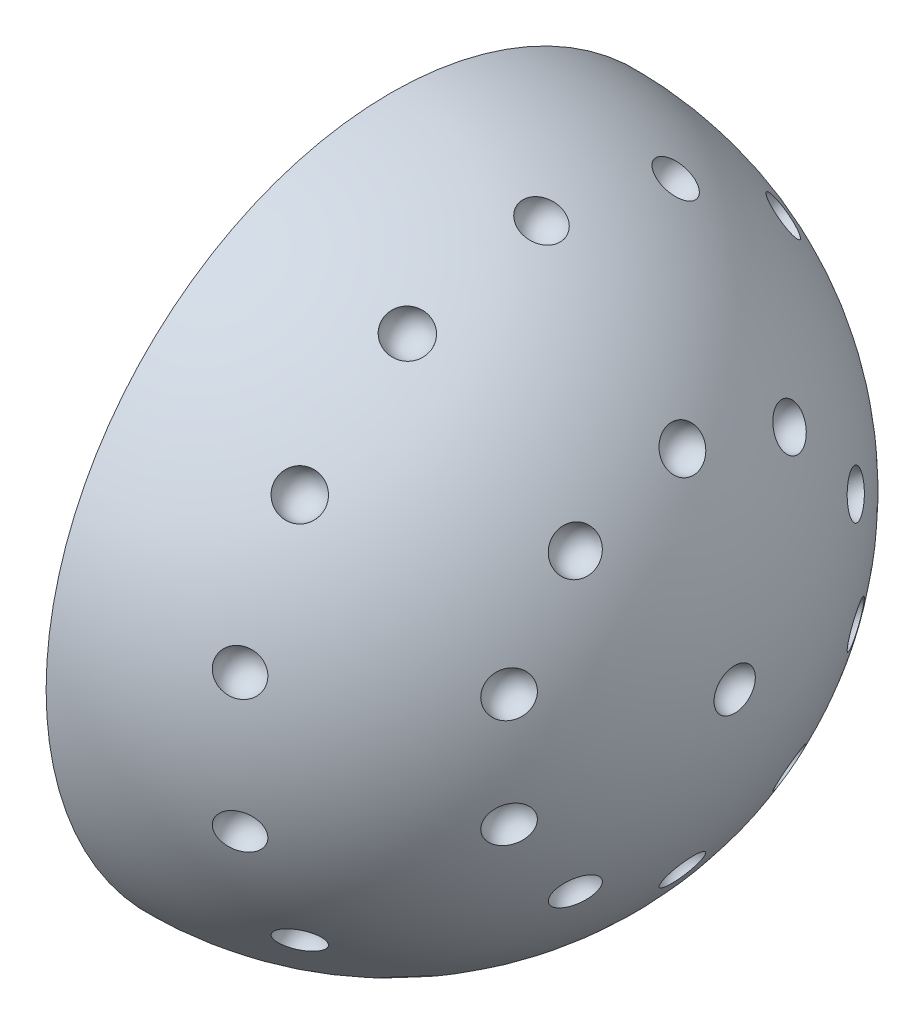
ISO-10303-21;
HEADER;
FILE_DESCRIPTION(('STEP AP214'),'2;1');
FILE_NAME('part.step','',(''),(''),'','','');
FILE_SCHEMA(('AUTOMOTIVE_DESIGN { 1 0 10303 214 1 1 1 1 }'));
ENDSEC;
DATA;
#1=APPLICATION_CONTEXT('core data for automotive mechanical design processes');
#2=APPLICATION_PROTOCOL_DEFINITION('international standard','automotive_design',2000,#1);
#3=PRODUCT_CONTEXT('',#1,'mechanical');
#4=PRODUCT('Part','Part','',(#3));
#5=PRODUCT_RELATED_PRODUCT_CATEGORY('part','',(#4));
#6=PRODUCT_DEFINITION_FORMATION('','',#4);
#7=PRODUCT_DEFINITION_CONTEXT('part definition',#1,'design');
#8=PRODUCT_DEFINITION('design','',#6,#7);
#9=PRODUCT_DEFINITION_SHAPE('','',#8);
#10=(LENGTH_UNIT() NAMED_UNIT(*) SI_UNIT(.MILLI.,.METRE.));
#11=(NAMED_UNIT(*) PLANE_ANGLE_UNIT() SI_UNIT($,.RADIAN.));
#12=(NAMED_UNIT(*) SI_UNIT($,.STERADIAN.) SOLID_ANGLE_UNIT());
#13=UNCERTAINTY_MEASURE_WITH_UNIT(LENGTH_MEASURE(1.E-05),#10,'distance_accuracy_value','');
#14=(GEOMETRIC_REPRESENTATION_CONTEXT(3) GLOBAL_UNCERTAINTY_ASSIGNED_CONTEXT((#13)) GLOBAL_UNIT_ASSIGNED_CONTEXT((#10,
#11,#12)) REPRESENTATION_CONTEXT('',''));
#15=CARTESIAN_POINT('',(0.,0.,0.));
#16=DIRECTION('',(0.,0.,1.));
#17=DIRECTION('',(1.,0.,0.));
#18=AXIS2_PLACEMENT_3D('',#15,#16,#17);
#19=CARTESIAN_POINT('',(43.8437023139506,80.9907145114152,39.0030724677829));
#20=DIRECTION('',(0.438371146789075,0.809785454371601,0.389972121504872));
#21=DIRECTION('',(0.898794046299168,-0.394958755843641,-0.190202112290091));
#22=AXIS2_PLACEMENT_3D('',#19,#20,#21);
#23=SPHERICAL_SURFACE('',#22,6.);
#24=CARTESIAN_POINT('',(43.7582202233519,80.8328068706339,38.9270281558668));
#25=DIRECTION('',(0.438371146789075,0.809785454371601,0.389972121504872));
#26=DIRECTION('',(-0.898794046299168,0.394958755843641,0.190202112290091));
#27=AXIS2_PLACEMENT_3D('',#24,#25,#26);
#28=CIRCLE('',#27,5.99683043380393);
#29=CARTESIAN_POINT('',(38.3683047327833,83.2013075577744,40.0676379714218));
#30=VERTEX_POINT('',#29);
#31=EDGE_CURVE('E10',#30,#30,#28,.T.);
#32=ORIENTED_EDGE('',*,*,#31,.T.);
#33=EDGE_LOOP('',(#32));
#34=FACE_BOUND('',#33,.T.);
#35=ADVANCED_FACE('F41',(#34),#23,.F.);
#36=CARTESIAN_POINT('',(43.8437023139506,56.047313444563,70.2811080920299));
#37=DIRECTION('',(0.438371146789075,0.560388921838886,0.702705481651511));
#38=DIRECTION('',(0.898794046299168,-0.273319939452111,-0.34273236356531));
#39=AXIS2_PLACEMENT_3D('',#36,#37,#38);
#40=SPHERICAL_SURFACE('',#39,6.);
#41=CARTESIAN_POINT('',(43.7582202233519,55.9380379666079,70.144080976795));
#42=DIRECTION('',(0.438371146789075,0.560388921838886,0.702705481651511));
#43=DIRECTION('',(-0.898794046299168,0.273319939452111,0.34273236356531));
#44=AXIS2_PLACEMENT_3D('',#41,#42,#43);
#45=CIRCLE('',#44,5.99683043380393);
#46=CARTESIAN_POINT('',(38.3683047327833,57.5770912976798,72.199388845273));
#47=VERTEX_POINT('',#46);
#48=EDGE_CURVE('E48',#47,#47,#45,.T.);
#49=ORIENTED_EDGE('',*,*,#48,.T.);
#50=EDGE_LOOP('',(#49));
#51=FACE_BOUND('',#50,.T.);
#52=ADVANCED_FACE('F178',(#51),#40,.F.);
#53=CARTESIAN_POINT('',(43.8437023139506,20.0030545748246,87.6391083174246));
#54=DIRECTION('',(0.438371146789075,0.200000490616875,0.876259403039899));
#55=DIRECTION('',(0.898794046299168,-0.0975467570030101,-0.427380266899824));
#56=AXIS2_PLACEMENT_3D('',#53,#54,#55);
#57=SPHERICAL_SURFACE('',#56,6.);
#58=CARTESIAN_POINT('',(43.7582202233519,19.9640546082805,87.4682382995704));
#59=DIRECTION('',(0.438371146789075,0.200000490616875,0.876259403039899));
#60=DIRECTION('',(-0.898794046299168,0.0975467570030101,0.427380266899824));
#61=AXIS2_PLACEMENT_3D('',#58,#59,#60);
#62=CIRCLE('',#61,5.99683043380393);
#63=CARTESIAN_POINT('',(38.3683047327833,20.549025969395,90.0311652909225));
#64=VERTEX_POINT('',#63);
#65=EDGE_CURVE('E53',#64,#64,#62,.T.);
#66=ORIENTED_EDGE('',*,*,#65,.T.);
#67=EDGE_LOOP('',(#66));
#68=FACE_BOUND('',#67,.T.);
#69=ADVANCED_FACE('F182',(#68),#57,.F.);
#70=CARTESIAN_POINT('',(43.8437023139506,-20.0030545748229,87.639108317425));
#71=DIRECTION('',(0.438371146789075,-0.200000490616857,0.876259403039903));
#72=DIRECTION('',(0.898794046299168,0.0975467570030015,-0.427380266899826));
#73=AXIS2_PLACEMENT_3D('',#70,#71,#72);
#74=SPHERICAL_SURFACE('',#73,6.);
#75=CARTESIAN_POINT('',(43.7582202233519,-19.9640546082787,87.4682382995708));
#76=DIRECTION('',(0.438371146789075,-0.200000490616857,0.876259403039903));
#77=DIRECTION('',(-0.898794046299168,-0.0975467570030015,0.427380266899826));
#78=AXIS2_PLACEMENT_3D('',#75,#76,#77);
#79=CIRCLE('',#78,5.99683043380393);
#80=CARTESIAN_POINT('',(38.3683047327833,-20.5490259693932,90.0311652909229));
#81=VERTEX_POINT('',#80);
#82=EDGE_CURVE('E58',#81,#81,#79,.T.);
#83=ORIENTED_EDGE('',*,*,#82,.T.);
#84=EDGE_LOOP('',(#83));
#85=FACE_BOUND('',#84,.T.);
#86=ADVANCED_FACE('F186',(#85),#74,.F.);
#87=CARTESIAN_POINT('',(43.8437023139506,-56.0473134445616,70.2811080920311));
#88=DIRECTION('',(0.438371146789075,-0.560388921838872,0.702705481651523));
#89=DIRECTION('',(0.898794046299168,0.273319939452103,-0.342732363565315));
#90=AXIS2_PLACEMENT_3D('',#87,#88,#89);
#91=SPHERICAL_SURFACE('',#90,6.);
#92=CARTESIAN_POINT('',(43.7582202233519,-55.9380379666064,70.1440809767962));
#93=DIRECTION('',(0.438371146789075,-0.560388921838872,0.702705481651522));
#94=DIRECTION('',(-0.898794046299168,-0.273319939452103,0.342732363565315));
#95=AXIS2_PLACEMENT_3D('',#92,#93,#94);
#96=CIRCLE('',#95,5.99683043380393);
#97=CARTESIAN_POINT('',(38.3683047327833,-57.5770912976782,72.1993888452742));
#98=VERTEX_POINT('',#97);
#99=EDGE_CURVE('E64',#98,#98,#96,.T.);
#100=ORIENTED_EDGE('',*,*,#99,.T.);
#101=EDGE_LOOP('',(#100));
#102=FACE_BOUND('',#101,.T.);
#103=ADVANCED_FACE('F192',(#102),#91,.F.);
#104=CARTESIAN_POINT('',(43.8437023139506,-80.9907145114144,39.0030724677846));
#105=DIRECTION('',(0.438371146789075,-0.809785454371593,0.389972121504889));
#106=DIRECTION('',(0.898794046299168,0.394958755843637,-0.190202112290099));
#107=AXIS2_PLACEMENT_3D('',#104,#105,#106);
#108=SPHERICAL_SURFACE('',#107,6.);
#109=CARTESIAN_POINT('',(43.7582202233519,-80.8328068706331,38.9270281558685));
#110=DIRECTION('',(0.438371146789075,-0.809785454371593,0.389972121504889));
#111=DIRECTION('',(-0.898794046299168,-0.394958755843637,0.190202112290099));
#112=AXIS2_PLACEMENT_3D('',#109,#110,#111);
#113=CIRCLE('',#112,5.99683043380393);
#114=CARTESIAN_POINT('',(38.3683047327833,-83.2013075577735,40.0676379714235));
#115=VERTEX_POINT('',#114);
#116=EDGE_CURVE('E68',#115,#115,#113,.T.);
#117=ORIENTED_EDGE('',*,*,#116,.T.);
#118=EDGE_LOOP('',(#117));
#119=FACE_BOUND('',#118,.T.);
#120=ADVANCED_FACE('F196',(#119),#108,.F.);
#121=CARTESIAN_POINT('',(43.8437023139506,-89.8929112833525,0.));
#122=DIRECTION('',(0.438371146789075,-0.898794046299168,0.));
#123=DIRECTION('',(0.898794046299168,0.438371146789075,0.));
#124=AXIS2_PLACEMENT_3D('',#121,#122,#123);
#125=SPHERICAL_SURFACE('',#124,6.);
#126=CARTESIAN_POINT('',(43.7582202233519,-89.7176470246118,0.));
#127=DIRECTION('',(0.438371146789075,-0.898794046299168,0.));
#128=DIRECTION('',(-0.898794046299168,-0.438371146789075,0.));
#129=AXIS2_PLACEMENT_3D('',#126,#127,#128);
#130=CIRCLE('',#129,5.99683043380393);
#131=CARTESIAN_POINT('',(38.3683047327833,-92.3464844589781,0.));
#132=VERTEX_POINT('',#131);
#133=EDGE_CURVE('E72',#132,#132,#130,.T.);
#134=ORIENTED_EDGE('',*,*,#133,.T.);
#135=EDGE_LOOP('',(#134));
#136=FACE_BOUND('',#135,.T.);
#137=ADVANCED_FACE('F200',(#136),#125,.F.);
#138=CARTESIAN_POINT('',(43.8437023139506,-80.990714511415,-39.0030724677834));
#139=DIRECTION('',(0.438371146789075,-0.809785454371599,-0.389972121504878));
#140=DIRECTION('',(0.898794046299168,0.39495875584364,0.190202112290094));
#141=AXIS2_PLACEMENT_3D('',#138,#139,#140);
#142=SPHERICAL_SURFACE('',#141,6.);
#143=CARTESIAN_POINT('',(43.7582202233519,-80.8328068706336,-38.9270281558674));
#144=DIRECTION('',(0.438371146789075,-0.809785454371598,-0.389972121504878));
#145=DIRECTION('',(-0.898794046299168,-0.39495875584364,-0.190202112290094));
#146=AXIS2_PLACEMENT_3D('',#143,#144,#145);
#147=CIRCLE('',#146,5.99683043380393);
#148=CARTESIAN_POINT('',(38.3683047327833,-83.2013075577741,-40.0676379714224));
#149=VERTEX_POINT('',#148);
#150=EDGE_CURVE('E76',#149,#149,#147,.T.);
#151=ORIENTED_EDGE('',*,*,#150,.T.);
#152=EDGE_LOOP('',(#151));
#153=FACE_BOUND('',#152,.T.);
#154=ADVANCED_FACE('F204',(#153),#142,.F.);
#155=CARTESIAN_POINT('',(43.8437023139506,-56.0473134445625,-70.2811080920303));
#156=DIRECTION('',(0.438371146789075,-0.560388921838881,-0.702705481651515));
#157=DIRECTION('',(0.898794046299168,0.273319939452108,0.342732363565312));
#158=AXIS2_PLACEMENT_3D('',#155,#156,#157);
#159=SPHERICAL_SURFACE('',#158,6.);
#160=CARTESIAN_POINT('',(43.7582202233519,-55.9380379666074,-70.1440809767954));
#161=DIRECTION('',(0.438371146789075,-0.560388921838881,-0.702705481651515));
#162=DIRECTION('',(-0.898794046299168,-0.273319939452108,-0.342732363565312));
#163=AXIS2_PLACEMENT_3D('',#160,#161,#162);
#164=CIRCLE('',#163,5.99683043380393);
#165=CARTESIAN_POINT('',(38.3683047327833,-57.5770912976792,-72.1993888452734));
#166=VERTEX_POINT('',#165);
#167=EDGE_CURVE('E80',#166,#166,#164,.T.);
#168=ORIENTED_EDGE('',*,*,#167,.T.);
#169=EDGE_LOOP('',(#168));
#170=FACE_BOUND('',#169,.T.);
#171=ADVANCED_FACE('F208',(#170),#159,.F.);
#172=CARTESIAN_POINT('',(43.8437023139506,-20.0030545748241,-87.6391083174247));
#173=DIRECTION('',(0.438371146789075,-0.200000490616869,-0.876259403039901));
#174=DIRECTION('',(0.898794046299168,0.0975467570030073,0.427380266899825));
#175=AXIS2_PLACEMENT_3D('',#172,#173,#174);
#176=SPHERICAL_SURFACE('',#175,6.);
#177=CARTESIAN_POINT('',(43.7582202233519,-19.9640546082799,-87.4682382995705));
#178=DIRECTION('',(0.438371146789075,-0.200000490616869,-0.8762594030399));
#179=DIRECTION('',(-0.898794046299168,-0.0975467570030073,-0.427380266899825));
#180=AXIS2_PLACEMENT_3D('',#177,#178,#179);
#181=CIRCLE('',#180,5.99683043380393);
#182=CARTESIAN_POINT('',(38.3683047327833,-20.5490259693944,-90.0311652909227));
#183=VERTEX_POINT('',#182);
#184=EDGE_CURVE('E84',#183,#183,#181,.T.);
#185=ORIENTED_EDGE('',*,*,#184,.T.);
#186=EDGE_LOOP('',(#185));
#187=FACE_BOUND('',#186,.T.);
#188=ADVANCED_FACE('F212',(#187),#176,.F.);
#189=CARTESIAN_POINT('',(43.8437023139506,20.0030545748234,-87.6391083174248));
#190=DIRECTION('',(0.438371146789075,0.200000490616863,-0.876259403039902));
#191=DIRECTION('',(0.898794046299168,-0.0975467570030043,0.427380266899825));
#192=AXIS2_PLACEMENT_3D('',#189,#190,#191);
#193=SPHERICAL_SURFACE('',#192,6.);
#194=CARTESIAN_POINT('',(43.7582202233519,19.9640546082793,-87.4682382995707));
#195=DIRECTION('',(0.438371146789075,0.200000490616863,-0.876259403039902));
#196=DIRECTION('',(-0.898794046299168,0.0975467570030043,-0.427380266899825));
#197=AXIS2_PLACEMENT_3D('',#194,#195,#196);
#198=CIRCLE('',#197,5.99683043380393);
#199=CARTESIAN_POINT('',(38.3683047327833,20.5490259693938,-90.0311652909228));
#200=VERTEX_POINT('',#199);
#201=EDGE_CURVE('E88',#200,#200,#198,.T.);
#202=ORIENTED_EDGE('',*,*,#201,.T.);
#203=EDGE_LOOP('',(#202));
#204=FACE_BOUND('',#203,.T.);
#205=ADVANCED_FACE('F216',(#204),#193,.F.);
#206=CARTESIAN_POINT('',(43.8437023139506,56.0473134445621,-70.2811080920307));
#207=DIRECTION('',(0.438371146789075,0.560388921838876,-0.702705481651519));
#208=DIRECTION('',(0.898794046299168,-0.273319939452106,0.342732363565314));
#209=AXIS2_PLACEMENT_3D('',#206,#207,#208);
#210=SPHERICAL_SURFACE('',#209,6.);
#211=CARTESIAN_POINT('',(43.7582202233519,55.9380379666069,-70.1440809767958));
#212=DIRECTION('',(0.438371146789075,0.560388921838876,-0.702705481651519));
#213=DIRECTION('',(-0.898794046299168,0.273319939452106,-0.342732363565314));
#214=AXIS2_PLACEMENT_3D('',#211,#212,#213);
#215=CIRCLE('',#214,5.99683043380393);
#216=CARTESIAN_POINT('',(38.3683047327833,57.5770912976787,-72.1993888452738));
#217=VERTEX_POINT('',#216);
#218=EDGE_CURVE('E92',#217,#217,#215,.T.);
#219=ORIENTED_EDGE('',*,*,#218,.T.);
#220=EDGE_LOOP('',(#219));
#221=FACE_BOUND('',#220,.T.);
#222=ADVANCED_FACE('F220',(#221),#210,.F.);
#223=CARTESIAN_POINT('',(43.8437023139506,80.9907145114147,-39.003072467784));
#224=DIRECTION('',(0.438371146789075,0.809785454371596,-0.389972121504884));
#225=DIRECTION('',(0.898794046299168,-0.394958755843638,0.190202112290096));
#226=AXIS2_PLACEMENT_3D('',#223,#224,#225);
#227=SPHERICAL_SURFACE('',#226,6.);
#228=CARTESIAN_POINT('',(43.7582202233519,80.8328068706333,-38.9270281558679));
#229=DIRECTION('',(0.438371146789075,0.809785454371596,-0.389972121504883));
#230=DIRECTION('',(-0.898794046299168,0.394958755843638,-0.190202112290096));
#231=AXIS2_PLACEMENT_3D('',#228,#229,#230);
#232=CIRCLE('',#231,5.99683043380393);
#233=CARTESIAN_POINT('',(38.3683047327833,83.2013075577738,-40.067637971423));
#234=VERTEX_POINT('',#233);
#235=EDGE_CURVE('E96',#234,#234,#232,.T.);
#236=ORIENTED_EDGE('',*,*,#235,.T.);
#237=EDGE_LOOP('',(#236));
#238=FACE_BOUND('',#237,.T.);
#239=ADVANCED_FACE('F224',(#238),#227,.F.);
#240=CARTESIAN_POINT('',(84.8175536828499,42.8778115484726,31.1525535977639));
#241=DIRECTION('',(0.848048096156425,0.428713690411336,0.311478728421951));
#242=DIRECTION('',(0.529919264233206,-0.686085321837874,-0.498470164155447));
#243=AXIS2_PLACEMENT_3D('',#240,#241,#242);
#244=SPHERICAL_SURFACE('',#243,6.);
#245=CARTESIAN_POINT('',(84.652184851624,42.7942126556324,31.0918154468214));
#246=DIRECTION('',(0.848048096156425,0.428713690411336,0.311478728421951));
#247=DIRECTION('',(-0.529919264233206,0.686085321837874,0.498470164155447));
#248=AXIS2_PLACEMENT_3D('',#245,#246,#247);
#249=CIRCLE('',#248,5.99683043380393);
#250=CARTESIAN_POINT('',(81.4743488804113,46.908549993816,34.081056497572));
#251=VERTEX_POINT('',#250);
#252=EDGE_CURVE('E100',#251,#251,#249,.T.);
#253=ORIENTED_EDGE('',*,*,#252,.T.);
#254=EDGE_LOOP('',(#253));
#255=FACE_BOUND('',#254,.T.);
#256=ADVANCED_FACE('F228',(#255),#244,.F.);
#257=CARTESIAN_POINT('',(84.8175536828499,16.3778666483042,50.4058905575355));
#258=DIRECTION('',(0.848048096156425,0.163754058294735,0.503983169359322));
#259=DIRECTION('',(0.529919264233206,-0.262061273759664,-0.806541667981264));
#260=AXIS2_PLACEMENT_3D('',#257,#258,#259);
#261=SPHERICAL_SURFACE('',#260,6.);
#262=CARTESIAN_POINT('',(84.652184851624,16.3459347126611,50.3076141648967));
#263=DIRECTION('',(0.848048096156425,0.163754058294735,0.503983169359322));
#264=DIRECTION('',(-0.529919264233206,0.262061273759664,0.806541667981264));
#265=AXIS2_PLACEMENT_3D('',#262,#263,#264);
#266=CIRCLE('',#265,5.99683043380393);
#267=CARTESIAN_POINT('',(81.4743488804113,17.9174717346645,55.1443077855777));
#268=VERTEX_POINT('',#267);
#269=EDGE_CURVE('E104',#268,#268,#266,.T.);
#270=ORIENTED_EDGE('',*,*,#269,.T.);
#271=EDGE_LOOP('',(#270));
#272=FACE_BOUND('',#271,.T.);
#273=ADVANCED_FACE('F232',(#272),#261,.F.);
#274=CARTESIAN_POINT('',(84.8175536828499,-16.3778666483031,50.4058905575358));
#275=DIRECTION('',(0.848048096156425,-0.163754058294724,0.503983169359325));
#276=DIRECTION('',(0.529919264233206,0.262061273759647,-0.80654166798127));
#277=AXIS2_PLACEMENT_3D('',#274,#275,#276);
#278=SPHERICAL_SURFACE('',#277,6.);
#279=CARTESIAN_POINT('',(84.652184851624,-16.3459347126601,50.307614164897));
#280=DIRECTION('',(0.848048096156425,-0.163754058294724,0.503983169359325));
#281=DIRECTION('',(-0.529919264233206,-0.262061273759647,0.80654166798127));
#282=AXIS2_PLACEMENT_3D('',#279,#280,#281);
#283=CIRCLE('',#282,5.99683043380393);
#284=CARTESIAN_POINT('',(81.4743488804113,-17.9174717346633,55.1443077855781));
#285=VERTEX_POINT('',#284);
#286=EDGE_CURVE('E108',#285,#285,#283,.T.);
#287=ORIENTED_EDGE('',*,*,#286,.T.);
#288=EDGE_LOOP('',(#287));
#289=FACE_BOUND('',#288,.T.);
#290=ADVANCED_FACE('F236',(#289),#278,.F.);
#291=CARTESIAN_POINT('',(84.8175536828499,-42.8778115484719,31.1525535977648));
#292=DIRECTION('',(0.848048096156425,-0.428713690411329,0.311478728421961));
#293=DIRECTION('',(0.529919264233206,0.686085321837863,-0.498470164155462));
#294=AXIS2_PLACEMENT_3D('',#291,#292,#293);
#295=SPHERICAL_SURFACE('',#294,6.);
#296=CARTESIAN_POINT('',(84.652184851624,-42.7942126556318,31.0918154468223));
#297=DIRECTION('',(0.848048096156425,-0.428713690411329,0.311478728421961));
#298=DIRECTION('',(-0.529919264233206,-0.686085321837863,0.498470164155462));
#299=AXIS2_PLACEMENT_3D('',#296,#297,#298);
#300=CIRCLE('',#299,5.99683043380393);
#301=CARTESIAN_POINT('',(81.4743488804113,-46.9085499938152,34.081056497573));
#302=VERTEX_POINT('',#301);
#303=EDGE_CURVE('E112',#302,#302,#300,.T.);
#304=ORIENTED_EDGE('',*,*,#303,.T.);
#305=EDGE_LOOP('',(#304));
#306=FACE_BOUND('',#305,.T.);
#307=ADVANCED_FACE('F240',(#306),#295,.F.);
#308=CARTESIAN_POINT('',(84.8175536828499,-52.9998898003371,0.));
#309=DIRECTION('',(0.848048096156425,-0.529919264233206,0.));
#310=DIRECTION('',(0.529919264233206,0.848048096156425,0.));
#311=AXIS2_PLACEMENT_3D('',#308,#309,#310);
#312=SPHERICAL_SURFACE('',#311,6.);
#313=CARTESIAN_POINT('',(84.652184851624,-52.896555885943,0.));
#314=DIRECTION('',(0.848048096156425,-0.529919264233206,0.));
#315=DIRECTION('',(-0.529919264233206,-0.848048096156425,0.));
#316=AXIS2_PLACEMENT_3D('',#313,#314,#315);
#317=CIRCLE('',#316,5.99683043380393);
#318=CARTESIAN_POINT('',(81.4743488804113,-57.9821565183033,0.));
#319=VERTEX_POINT('',#318);
#320=EDGE_CURVE('E116',#319,#319,#317,.T.);
#321=ORIENTED_EDGE('',*,*,#320,.T.);
#322=EDGE_LOOP('',(#321));
#323=FACE_BOUND('',#322,.T.);
#324=ADVANCED_FACE('F244',(#323),#312,.F.);
#325=CARTESIAN_POINT('',(84.8175536828499,-42.8778115484724,-31.1525535977642));
#326=DIRECTION('',(0.848048096156425,-0.428713690411334,-0.311478728421954));
#327=DIRECTION('',(0.529919264233206,0.68608532183787,0.498470164155452));
#328=AXIS2_PLACEMENT_3D('',#325,#326,#327);
#329=SPHERICAL_SURFACE('',#328,6.);
#330=CARTESIAN_POINT('',(84.652184851624,-42.7942126556322,-31.0918154468217));
#331=DIRECTION('',(0.848048096156425,-0.428713690411334,-0.311478728421954));
#332=DIRECTION('',(-0.529919264233206,-0.68608532183787,-0.498470164155452));
#333=AXIS2_PLACEMENT_3D('',#330,#331,#332);
#334=CIRCLE('',#333,5.99683043380393);
#335=CARTESIAN_POINT('',(81.4743488804113,-46.9085499938157,-34.0810564975723));
#336=VERTEX_POINT('',#335);
#337=EDGE_CURVE('E120',#336,#336,#334,.T.);
#338=ORIENTED_EDGE('',*,*,#337,.T.);
#339=EDGE_LOOP('',(#338));
#340=FACE_BOUND('',#339,.T.);
#341=ADVANCED_FACE('F248',(#340),#329,.F.);
#342=CARTESIAN_POINT('',(84.8175536828499,-16.3778666483038,-50.4058905575356));
#343=DIRECTION('',(0.848048096156425,-0.163754058294731,-0.503983169359323));
#344=DIRECTION('',(0.529919264233206,0.262061273759658,0.806541667981266));
#345=AXIS2_PLACEMENT_3D('',#342,#343,#344);
#346=SPHERICAL_SURFACE('',#345,6.);
#347=CARTESIAN_POINT('',(84.652184851624,-16.3459347126608,-50.3076141648968));
#348=DIRECTION('',(0.848048096156425,-0.163754058294731,-0.503983169359323));
#349=DIRECTION('',(-0.529919264233206,-0.262061273759658,-0.806541667981266));
#350=AXIS2_PLACEMENT_3D('',#347,#348,#349);
#351=CIRCLE('',#350,5.99683043380393);
#352=CARTESIAN_POINT('',(81.4743488804113,-17.9174717346641,-55.1443077855778));
#353=VERTEX_POINT('',#352);
#354=EDGE_CURVE('E124',#353,#353,#351,.T.);
#355=ORIENTED_EDGE('',*,*,#354,.T.);
#356=EDGE_LOOP('',(#355));
#357=FACE_BOUND('',#356,.T.);
#358=ADVANCED_FACE('F252',(#357),#346,.F.);
#359=CARTESIAN_POINT('',(84.8175536828499,16.3778666483035,-50.4058905575357));
#360=DIRECTION('',(0.848048096156425,0.163754058294728,-0.503983169359324));
#361=DIRECTION('',(0.529919264233206,-0.262061273759653,0.806541667981268));
#362=AXIS2_PLACEMENT_3D('',#359,#360,#361);
#363=SPHERICAL_SURFACE('',#362,6.);
#364=CARTESIAN_POINT('',(84.652184851624,16.3459347126604,-50.3076141648969));
#365=DIRECTION('',(0.848048096156425,0.163754058294728,-0.503983169359324));
#366=DIRECTION('',(-0.529919264233206,0.262061273759653,-0.806541667981268));
#367=AXIS2_PLACEMENT_3D('',#364,#365,#366);
#368=CIRCLE('',#367,5.99683043380393);
#369=CARTESIAN_POINT('',(81.4743488804113,17.9174717346637,-55.144307785578));
#370=VERTEX_POINT('',#369);
#371=EDGE_CURVE('E128',#370,#370,#368,.T.);
#372=ORIENTED_EDGE('',*,*,#371,.T.);
#373=EDGE_LOOP('',(#372));
#374=FACE_BOUND('',#373,.T.);
#375=ADVANCED_FACE('F256',(#374),#363,.F.);
#376=CARTESIAN_POINT('',(84.8175536828499,42.8778115484722,-31.1525535977645));
#377=DIRECTION('',(0.848048096156425,0.428713690411332,-0.311478728421957));
#378=DIRECTION('',(0.529919264233206,-0.686085321837867,0.498470164155457));
#379=AXIS2_PLACEMENT_3D('',#376,#377,#378);
#380=SPHERICAL_SURFACE('',#379,6.);
#381=CARTESIAN_POINT('',(84.652184851624,42.794212655632,-31.091815446822));
#382=DIRECTION('',(0.848048096156425,0.428713690411332,-0.311478728421957));
#383=DIRECTION('',(-0.529919264233206,0.686085321837867,-0.498470164155457));
#384=AXIS2_PLACEMENT_3D('',#381,#382,#383);
#385=CIRCLE('',#384,5.99683043380393);
#386=CARTESIAN_POINT('',(81.4743488804113,46.9085499938155,-34.0810564975727));
#387=VERTEX_POINT('',#386);
#388=EDGE_CURVE('E132',#387,#387,#385,.T.);
#389=ORIENTED_EDGE('',*,*,#388,.T.);
#390=EDGE_LOOP('',(#389));
#391=FACE_BOUND('',#390,.T.);
#392=ADVANCED_FACE('F158',(#391),#380,.F.);
#393=CARTESIAN_POINT('',(0.,0.,0.));
#394=DIRECTION('',(-1.,0.,0.));
#395=DIRECTION('',(0.,1.,0.));
#396=AXIS2_PLACEMENT_3D('',#393,#394,#395);
#397=SPHERICAL_SURFACE('',#396,100.);
#398=ORIENTED_EDGE('',*,*,#31,.F.);
#399=EDGE_LOOP('',(#398));
#400=FACE_BOUND('',#399,.T.);
#401=ORIENTED_EDGE('',*,*,#48,.F.);
#402=EDGE_LOOP('',(#401));
#403=FACE_BOUND('',#402,.T.);
#404=ORIENTED_EDGE('',*,*,#65,.F.);
#405=EDGE_LOOP('',(#404));
#406=FACE_BOUND('',#405,.T.);
#407=ORIENTED_EDGE('',*,*,#82,.F.);
#408=EDGE_LOOP('',(#407));
#409=FACE_BOUND('',#408,.T.);
#410=ORIENTED_EDGE('',*,*,#99,.F.);
#411=EDGE_LOOP('',(#410));
#412=FACE_BOUND('',#411,.T.);
#413=ORIENTED_EDGE('',*,*,#116,.F.);
#414=EDGE_LOOP('',(#413));
#415=FACE_BOUND('',#414,.T.);
#416=ORIENTED_EDGE('',*,*,#133,.F.);
#417=EDGE_LOOP('',(#416));
#418=FACE_BOUND('',#417,.T.);
#419=ORIENTED_EDGE('',*,*,#150,.F.);
#420=EDGE_LOOP('',(#419));
#421=FACE_BOUND('',#420,.T.);
#422=ORIENTED_EDGE('',*,*,#167,.F.);
#423=EDGE_LOOP('',(#422));
#424=FACE_BOUND('',#423,.T.);
#425=ORIENTED_EDGE('',*,*,#184,.F.);
#426=EDGE_LOOP('',(#425));
#427=FACE_BOUND('',#426,.T.);
#428=ORIENTED_EDGE('',*,*,#201,.F.);
#429=EDGE_LOOP('',(#428));
#430=FACE_BOUND('',#429,.T.);
#431=ORIENTED_EDGE('',*,*,#218,.F.);
#432=EDGE_LOOP('',(#431));
#433=FACE_BOUND('',#432,.T.);
#434=ORIENTED_EDGE('',*,*,#235,.F.);
#435=EDGE_LOOP('',(#434));
#436=FACE_BOUND('',#435,.T.);
#437=ORIENTED_EDGE('',*,*,#252,.F.);
#438=EDGE_LOOP('',(#437));
#439=FACE_BOUND('',#438,.T.);
#440=ORIENTED_EDGE('',*,*,#269,.F.);
#441=EDGE_LOOP('',(#440));
#442=FACE_BOUND('',#441,.T.);
#443=ORIENTED_EDGE('',*,*,#286,.F.);
#444=EDGE_LOOP('',(#443));
#445=FACE_BOUND('',#444,.T.);
#446=ORIENTED_EDGE('',*,*,#303,.F.);
#447=EDGE_LOOP('',(#446));
#448=FACE_BOUND('',#447,.T.);
#449=ORIENTED_EDGE('',*,*,#320,.F.);
#450=EDGE_LOOP('',(#449));
#451=FACE_BOUND('',#450,.T.);
#452=ORIENTED_EDGE('',*,*,#337,.F.);
#453=EDGE_LOOP('',(#452));
#454=FACE_BOUND('',#453,.T.);
#455=ORIENTED_EDGE('',*,*,#354,.F.);
#456=EDGE_LOOP('',(#455));
#457=FACE_BOUND('',#456,.T.);
#458=ORIENTED_EDGE('',*,*,#371,.F.);
#459=EDGE_LOOP('',(#458));
#460=FACE_BOUND('',#459,.T.);
#461=ORIENTED_EDGE('',*,*,#388,.F.);
#462=EDGE_LOOP('',(#461));
#463=FACE_BOUND('',#462,.T.);
#464=CARTESIAN_POINT('',(0.,0.,0.));
#465=DIRECTION('',(-1.,0.,0.));
#466=DIRECTION('',(0.,0.,1.));
#467=AXIS2_PLACEMENT_3D('',#464,#465,#466);
#468=CIRCLE('',#467,100.);
#469=CARTESIAN_POINT('',(0.,0.,100.));
#470=VERTEX_POINT('',#469);
#471=EDGE_CURVE('E136',#470,#470,#468,.T.);
#472=ORIENTED_EDGE('',*,*,#471,.F.);
#473=EDGE_LOOP('',(#472));
#474=FACE_BOUND('',#473,.T.);
#475=CARTESIAN_POINT('',(99.8200281744511,0.,0.));
#476=DIRECTION('',(1.,0.,0.));
#477=DIRECTION('',(0.,1.,0.));
#478=AXIS2_PLACEMENT_3D('',#475,#476,#477);
#479=CIRCLE('',#478,5.99683043380393);
#480=CARTESIAN_POINT('',(99.8200281744511,5.99683043380393,0.));
#481=VERTEX_POINT('',#480);
#482=EDGE_CURVE('E145',#481,#481,#479,.T.);
#483=ORIENTED_EDGE('',*,*,#482,.F.);
#484=EDGE_LOOP('',(#483));
#485=FACE_BOUND('',#484,.T.);
#486=CARTESIAN_POINT('',(84.652184851624,52.896555885943,0.));
#487=DIRECTION('',(0.848048096156425,0.529919264233206,0.));
#488=DIRECTION('',(-0.529919264233206,0.848048096156425,0.));
#489=AXIS2_PLACEMENT_3D('',#486,#487,#488);
#490=CIRCLE('',#489,5.99683043380393);
#491=CARTESIAN_POINT('',(81.4743488804113,57.9821565183033,0.));
#492=VERTEX_POINT('',#491);
#493=EDGE_CURVE('E141',#492,#492,#490,.T.);
#494=ORIENTED_EDGE('',*,*,#493,.F.);
#495=EDGE_LOOP('',(#494));
#496=FACE_BOUND('',#495,.T.);
#497=CARTESIAN_POINT('',(43.7582202233519,89.7176470246118,0.));
#498=DIRECTION('',(0.438371146789075,0.898794046299168,0.));
#499=DIRECTION('',(-0.898794046299168,0.438371146789075,0.));
#500=AXIS2_PLACEMENT_3D('',#497,#498,#499);
#501=CIRCLE('',#500,5.99683043380393);
#502=CARTESIAN_POINT('',(38.3683047327833,92.3464844589781,0.));
#503=VERTEX_POINT('',#502);
#504=EDGE_CURVE('E137',#503,#503,#501,.T.);
#505=ORIENTED_EDGE('',*,*,#504,.F.);
#506=EDGE_LOOP('',(#505));
#507=FACE_BOUND('',#506,.T.);
#508=ADVANCED_FACE('F155',(#400,#403,#406,#409,#412,#415,#418,#421,#424,#427,#430,#433,#436,
#439,#442,#445,#448,#451,#454,#457,#460,#463,#474,#485,#496,#507),#397,.T.);
#509=CARTESIAN_POINT('',(0.,100.,0.));
#510=DIRECTION('',(1.,0.,0.));
#511=DIRECTION('',(0.,0.,-1.));
#512=AXIS2_PLACEMENT_3D('',#509,#510,#511);
#513=PLANE('',#512);
#514=ORIENTED_EDGE('',*,*,#471,.T.);
#515=EDGE_LOOP('',(#514));
#516=FACE_BOUND('',#515,.T.);
#517=ADVANCED_FACE('F153',(#516),#513,.F.);
#518=CARTESIAN_POINT('',(100.015027528822,0.,0.));
#519=DIRECTION('',(1.,0.,0.));
#520=DIRECTION('',(0.,-1.,0.));
#521=AXIS2_PLACEMENT_3D('',#518,#519,#520);
#522=SPHERICAL_SURFACE('',#521,6.);
#523=ORIENTED_EDGE('',*,*,#482,.T.);
#524=EDGE_LOOP('',(#523));
#525=FACE_BOUND('',#524,.T.);
#526=ADVANCED_FACE('F174',(#525),#522,.F.);
#527=CARTESIAN_POINT('',(84.8175536828499,52.9998898003371,0.));
#528=DIRECTION('',(0.848048096156425,0.529919264233206,0.));
#529=DIRECTION('',(0.529919264233206,-0.848048096156425,0.));
#530=AXIS2_PLACEMENT_3D('',#527,#528,#529);
#531=SPHERICAL_SURFACE('',#530,6.);
#532=ORIENTED_EDGE('',*,*,#493,.T.);
#533=EDGE_LOOP('',(#532));
#534=FACE_BOUND('',#533,.T.);
#535=ADVANCED_FACE('F169',(#534),#531,.F.);
#536=CARTESIAN_POINT('',(43.8437023139506,89.8929112833525,0.));
#537=DIRECTION('',(0.438371146789075,0.898794046299168,0.));
#538=DIRECTION('',(0.898794046299168,-0.438371146789075,0.));
#539=AXIS2_PLACEMENT_3D('',#536,#537,#538);
#540=SPHERICAL_SURFACE('',#539,6.);
#541=ORIENTED_EDGE('',*,*,#504,.T.);
#542=EDGE_LOOP('',(#541));
#543=FACE_BOUND('',#542,.T.);
#544=ADVANCED_FACE('F167',(#543),#540,.F.);
#545=CLOSED_SHELL('',(#35,#52,#69,#86,#103,#120,#137,#154,#171,#188,#205,#222,#239,#256,#273,
#290,#307,#324,#341,#358,#375,#392,#508,#517,#526,#535,#544));
#546=MANIFOLD_SOLID_BREP('B2',#545);
#547=ADVANCED_BREP_SHAPE_REPRESENTATION('',(#18,#546),#14);
#548=SHAPE_DEFINITION_REPRESENTATION(#9,#547);
ENDSEC;
END-ISO-10303-21;
